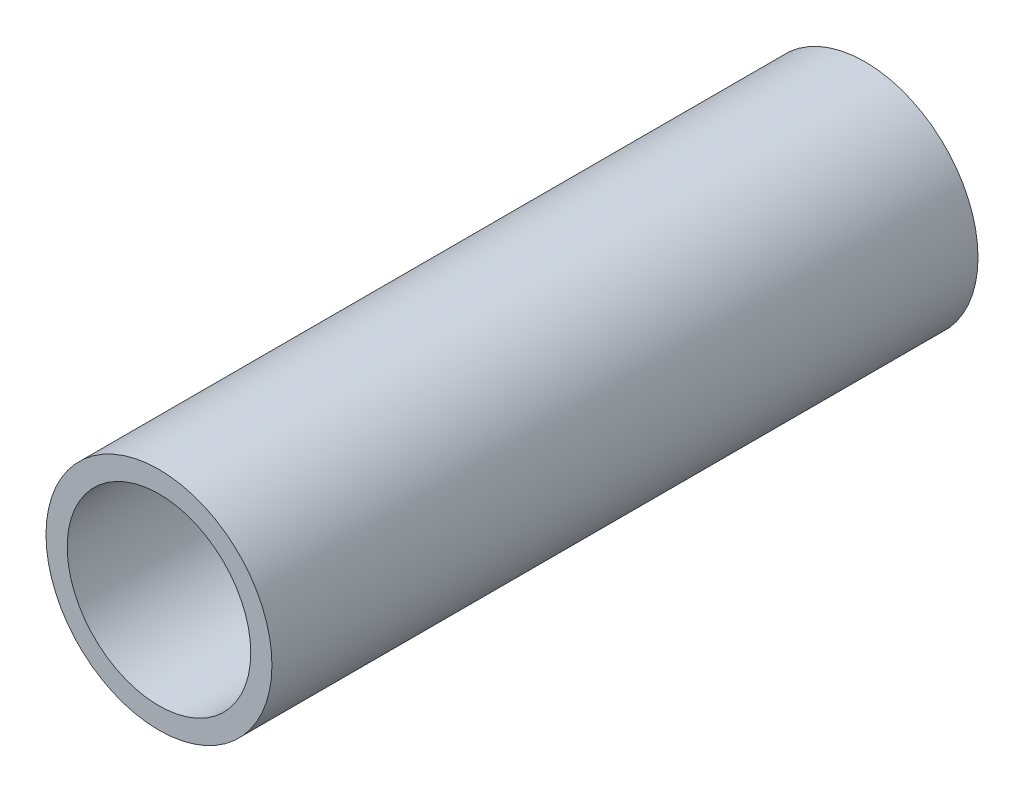
ISO-10303-21;
HEADER;
FILE_DESCRIPTION(('STEP AP214'),'2;1');
FILE_NAME('part.step','',(''),(''),'','','');
FILE_SCHEMA(('AUTOMOTIVE_DESIGN { 1 0 10303 214 1 1 1 1 }'));
ENDSEC;
DATA;
#1=APPLICATION_CONTEXT('core data for automotive mechanical design processes');
#2=APPLICATION_PROTOCOL_DEFINITION('international standard','automotive_design',2000,#1);
#3=PRODUCT_CONTEXT('',#1,'mechanical');
#4=PRODUCT('Part','Part','',(#3));
#5=PRODUCT_RELATED_PRODUCT_CATEGORY('part','',(#4));
#6=PRODUCT_DEFINITION_FORMATION('','',#4);
#7=PRODUCT_DEFINITION_CONTEXT('part definition',#1,'design');
#8=PRODUCT_DEFINITION('design','',#6,#7);
#9=PRODUCT_DEFINITION_SHAPE('','',#8);
#10=(LENGTH_UNIT() NAMED_UNIT(*) SI_UNIT(.MILLI.,.METRE.));
#11=(NAMED_UNIT(*) PLANE_ANGLE_UNIT() SI_UNIT($,.RADIAN.));
#12=(NAMED_UNIT(*) SI_UNIT($,.STERADIAN.) SOLID_ANGLE_UNIT());
#13=UNCERTAINTY_MEASURE_WITH_UNIT(LENGTH_MEASURE(1.E-05),#10,'distance_accuracy_value','');
#14=(GEOMETRIC_REPRESENTATION_CONTEXT(3) GLOBAL_UNCERTAINTY_ASSIGNED_CONTEXT((#13)) GLOBAL_UNIT_ASSIGNED_CONTEXT((#10,
#11,#12)) REPRESENTATION_CONTEXT('',''));
#15=CARTESIAN_POINT('',(0.,0.,0.));
#16=DIRECTION('',(0.,0.,1.));
#17=DIRECTION('',(1.,0.,0.));
#18=AXIS2_PLACEMENT_3D('',#15,#16,#17);
#19=CARTESIAN_POINT('',(0.,0.,50.));
#20=DIRECTION('',(0.,0.,1.));
#21=DIRECTION('',(1.,0.,0.));
#22=AXIS2_PLACEMENT_3D('',#19,#20,#21);
#23=PLANE('',#22);
#24=CARTESIAN_POINT('',(0.,0.,50.));
#25=DIRECTION('',(0.,0.,1.));
#26=DIRECTION('',(1.,0.,0.));
#27=AXIS2_PLACEMENT_3D('',#24,#25,#26);
#28=CIRCLE('',#27,8.);
#29=CARTESIAN_POINT('',(8.,0.,50.));
#30=VERTEX_POINT('',#29);
#31=EDGE_CURVE('E10',#30,#30,#28,.T.);
#32=ORIENTED_EDGE('',*,*,#31,.T.);
#33=EDGE_LOOP('',(#32));
#34=FACE_BOUND('',#33,.T.);
#35=CARTESIAN_POINT('',(0.,0.,50.));
#36=DIRECTION('',(0.,0.,1.));
#37=DIRECTION('',(1.,0.,0.));
#38=AXIS2_PLACEMENT_3D('',#35,#36,#37);
#39=CIRCLE('',#38,6.5);
#40=CARTESIAN_POINT('',(6.5,0.,50.));
#41=VERTEX_POINT('',#40);
#42=EDGE_CURVE('E41',#41,#41,#39,.T.);
#43=ORIENTED_EDGE('',*,*,#42,.F.);
#44=EDGE_LOOP('',(#43));
#45=FACE_BOUND('',#44,.T.);
#46=ADVANCED_FACE('F30',(#34,#45),#23,.T.);
#47=CARTESIAN_POINT('',(0.,0.,0.));
#48=DIRECTION('',(0.,0.,1.));
#49=DIRECTION('',(1.,0.,0.));
#50=AXIS2_PLACEMENT_3D('',#47,#48,#49);
#51=PLANE('',#50);
#52=CARTESIAN_POINT('',(0.,0.,0.));
#53=DIRECTION('',(0.,0.,1.));
#54=DIRECTION('',(1.,0.,0.));
#55=AXIS2_PLACEMENT_3D('',#52,#53,#54);
#56=CIRCLE('',#55,8.);
#57=CARTESIAN_POINT('',(8.,0.,0.));
#58=VERTEX_POINT('',#57);
#59=EDGE_CURVE('E34',#58,#58,#56,.T.);
#60=ORIENTED_EDGE('',*,*,#59,.F.);
#61=EDGE_LOOP('',(#60));
#62=FACE_BOUND('',#61,.T.);
#63=CARTESIAN_POINT('',(0.,0.,0.));
#64=DIRECTION('',(0.,0.,1.));
#65=DIRECTION('',(1.,0.,0.));
#66=AXIS2_PLACEMENT_3D('',#63,#64,#65);
#67=CIRCLE('',#66,6.5);
#68=CARTESIAN_POINT('',(6.5,0.,0.));
#69=VERTEX_POINT('',#68);
#70=EDGE_CURVE('E43',#69,#69,#67,.T.);
#71=ORIENTED_EDGE('',*,*,#70,.T.);
#72=EDGE_LOOP('',(#71));
#73=FACE_BOUND('',#72,.T.);
#74=ADVANCED_FACE('F53',(#62,#73),#51,.F.);
#75=CARTESIAN_POINT('',(0.,0.,50.));
#76=DIRECTION('',(0.,0.,-1.));
#77=DIRECTION('',(-1.,0.,0.));
#78=AXIS2_PLACEMENT_3D('',#75,#76,#77);
#79=CYLINDRICAL_SURFACE('',#78,8.);
#80=ORIENTED_EDGE('',*,*,#31,.F.);
#81=EDGE_LOOP('',(#80));
#82=FACE_BOUND('',#81,.T.);
#83=ORIENTED_EDGE('',*,*,#59,.T.);
#84=EDGE_LOOP('',(#83));
#85=FACE_BOUND('',#84,.T.);
#86=ADVANCED_FACE('F32',(#82,#85),#79,.T.);
#87=CARTESIAN_POINT('',(0.,0.,50.));
#88=DIRECTION('',(0.,0.,-1.));
#89=DIRECTION('',(-1.,0.,0.));
#90=AXIS2_PLACEMENT_3D('',#87,#88,#89);
#91=CYLINDRICAL_SURFACE('',#90,6.5);
#92=ORIENTED_EDGE('',*,*,#42,.T.);
#93=EDGE_LOOP('',(#92));
#94=FACE_BOUND('',#93,.T.);
#95=ORIENTED_EDGE('',*,*,#70,.F.);
#96=EDGE_LOOP('',(#95));
#97=FACE_BOUND('',#96,.T.);
#98=ADVANCED_FACE('F49',(#94,#97),#91,.F.);
#99=CLOSED_SHELL('',(#46,#74,#86,#98));
#100=MANIFOLD_SOLID_BREP('B2',#99);
#101=ADVANCED_BREP_SHAPE_REPRESENTATION('',(#18,#100),#14);
#102=SHAPE_DEFINITION_REPRESENTATION(#9,#101);
ENDSEC;
END-ISO-10303-21;
